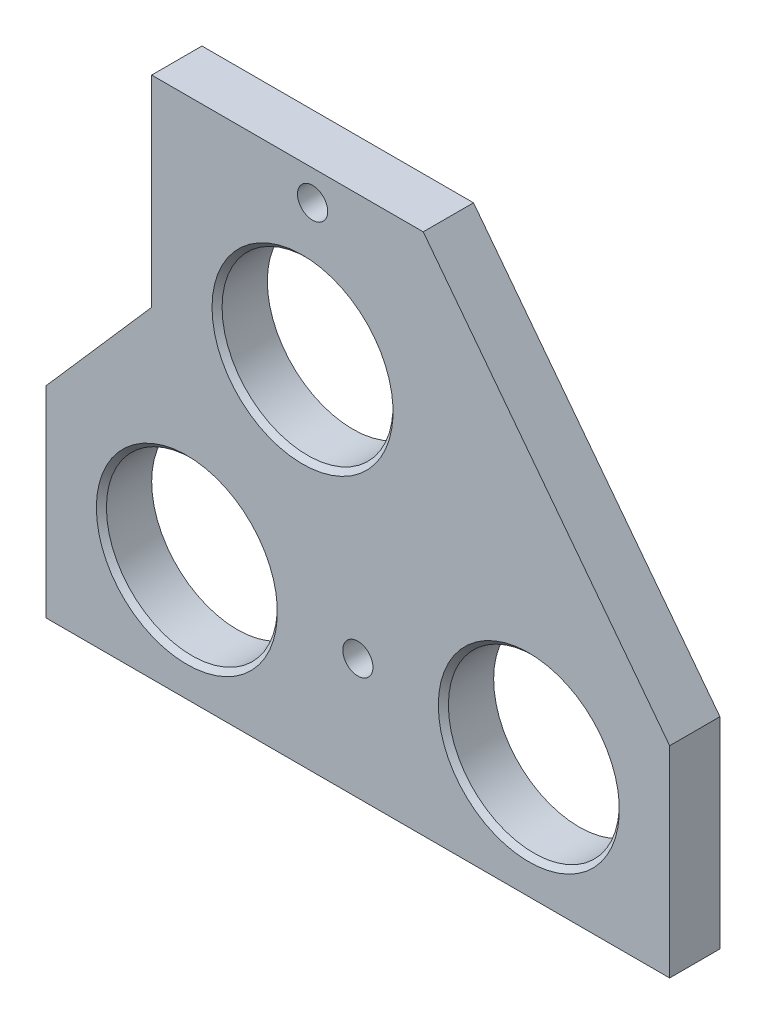
ISO-10303-21;
HEADER;
FILE_DESCRIPTION(('STEP AP214'),'2;1');
FILE_NAME('part.step','',(''),(''),'','','');
FILE_SCHEMA(('AUTOMOTIVE_DESIGN { 1 0 10303 214 1 1 1 1 }'));
ENDSEC;
DATA;
#1=APPLICATION_CONTEXT('core data for automotive mechanical design processes');
#2=APPLICATION_PROTOCOL_DEFINITION('international standard','automotive_design',2000,#1);
#3=PRODUCT_CONTEXT('',#1,'mechanical');
#4=PRODUCT('Part','Part','',(#3));
#5=PRODUCT_RELATED_PRODUCT_CATEGORY('part','',(#4));
#6=PRODUCT_DEFINITION_FORMATION('','',#4);
#7=PRODUCT_DEFINITION_CONTEXT('part definition',#1,'design');
#8=PRODUCT_DEFINITION('design','',#6,#7);
#9=PRODUCT_DEFINITION_SHAPE('','',#8);
#10=(LENGTH_UNIT() NAMED_UNIT(*) SI_UNIT(.MILLI.,.METRE.));
#11=(NAMED_UNIT(*) PLANE_ANGLE_UNIT() SI_UNIT($,.RADIAN.));
#12=(NAMED_UNIT(*) SI_UNIT($,.STERADIAN.) SOLID_ANGLE_UNIT());
#13=UNCERTAINTY_MEASURE_WITH_UNIT(LENGTH_MEASURE(1.E-05),#10,'distance_accuracy_value','');
#14=(GEOMETRIC_REPRESENTATION_CONTEXT(3) GLOBAL_UNCERTAINTY_ASSIGNED_CONTEXT((#13)) GLOBAL_UNIT_ASSIGNED_CONTEXT((#10,
#11,#12)) REPRESENTATION_CONTEXT('',''));
#15=CARTESIAN_POINT('',(0.,0.,0.));
#16=DIRECTION('',(0.,0.,1.));
#17=DIRECTION('',(1.,0.,0.));
#18=AXIS2_PLACEMENT_3D('',#15,#16,#17);
#19=CARTESIAN_POINT('',(0.,0.,5.));
#20=DIRECTION('',(0.,0.,-1.));
#21=DIRECTION('',(-1.,0.,0.));
#22=AXIS2_PLACEMENT_3D('',#19,#20,#21);
#23=PLANE('',#22);
#24=CARTESIAN_POINT('',(34.,0.,5.));
#25=DIRECTION('',(0.,0.,-1.));
#26=DIRECTION('',(-1.,0.,0.));
#27=AXIS2_PLACEMENT_3D('',#24,#25,#26);
#28=CIRCLE('',#27,8.99999999999999);
#29=CARTESIAN_POINT('',(25.,0.,5.));
#30=VERTEX_POINT('',#29);
#31=EDGE_CURVE('E190',#30,#30,#28,.T.);
#32=ORIENTED_EDGE('',*,*,#31,.T.);
#33=EDGE_LOOP('',(#32));
#34=FACE_BOUND('',#33,.T.);
#35=CARTESIAN_POINT('',(11.5,23.,5.));
#36=DIRECTION('',(0.,0.,-1.));
#37=DIRECTION('',(-1.,0.,0.));
#38=AXIS2_PLACEMENT_3D('',#35,#36,#37);
#39=CIRCLE('',#38,9.00000000000002);
#40=CARTESIAN_POINT('',(2.49999999999997,23.,5.));
#41=VERTEX_POINT('',#40);
#42=EDGE_CURVE('E186',#41,#41,#39,.T.);
#43=ORIENTED_EDGE('',*,*,#42,.T.);
#44=EDGE_LOOP('',(#43));
#45=FACE_BOUND('',#44,.T.);
#46=CARTESIAN_POINT('',(0.,0.,5.));
#47=DIRECTION('',(0.,0.,-1.));
#48=DIRECTION('',(-1.,0.,0.));
#49=AXIS2_PLACEMENT_3D('',#46,#47,#48);
#50=CIRCLE('',#49,9.00000000000002);
#51=CARTESIAN_POINT('',(-9.00000000000002,0.,5.));
#52=VERTEX_POINT('',#51);
#53=EDGE_CURVE('E182',#52,#52,#50,.T.);
#54=ORIENTED_EDGE('',*,*,#53,.T.);
#55=EDGE_LOOP('',(#54));
#56=FACE_BOUND('',#55,.T.);
#57=DIRECTION('',(1.,0.,0.));
#58=VECTOR('',#57,1.);
#59=CARTESIAN_POINT('',(48.,-12.,5.));
#60=LINE('',#59,#58);
#61=CARTESIAN_POINT('',(-14.,-12.,5.));
#62=VERTEX_POINT('',#61);
#63=CARTESIAN_POINT('',(48.,-12.,5.));
#64=VERTEX_POINT('',#63);
#65=EDGE_CURVE('E160',#62,#64,#60,.T.);
#66=ORIENTED_EDGE('',*,*,#65,.T.);
#67=DIRECTION('',(0.,1.,0.));
#68=VECTOR('',#67,1.);
#69=CARTESIAN_POINT('',(48.,8.00000000000001,5.));
#70=LINE('',#69,#68);
#71=CARTESIAN_POINT('',(48.,8.00000000000001,5.));
#72=VERTEX_POINT('',#71);
#73=EDGE_CURVE('E101',#64,#72,#70,.T.);
#74=ORIENTED_EDGE('',*,*,#73,.T.);
#75=DIRECTION('',(-0.607910502716913,0.794005554569029,0.));
#76=VECTOR('',#75,1.);
#77=CARTESIAN_POINT('',(23.5,40.,5.));
#78=LINE('',#77,#76);
#79=CARTESIAN_POINT('',(23.5,40.,5.));
#80=VERTEX_POINT('',#79);
#81=EDGE_CURVE('E268',#72,#80,#78,.T.);
#82=ORIENTED_EDGE('',*,*,#81,.T.);
#83=DIRECTION('',(-1.,0.,0.));
#84=VECTOR('',#83,1.);
#85=CARTESIAN_POINT('',(-3.5,40.,5.));
#86=LINE('',#85,#84);
#87=CARTESIAN_POINT('',(-3.5,40.,5.));
#88=VERTEX_POINT('',#87);
#89=EDGE_CURVE('E117',#80,#88,#86,.T.);
#90=ORIENTED_EDGE('',*,*,#89,.T.);
#91=DIRECTION('',(0.,-1.,0.));
#92=VECTOR('',#91,1.);
#93=CARTESIAN_POINT('',(-3.5,40.,5.));
#94=LINE('',#93,#92);
#95=CARTESIAN_POINT('',(-3.5,20.,5.));
#96=VERTEX_POINT('',#95);
#97=EDGE_CURVE('E111',#88,#96,#94,.T.);
#98=ORIENTED_EDGE('',*,*,#97,.T.);
#99=DIRECTION('',(-0.658504607868518,-0.752576694706878,0.));
#100=VECTOR('',#99,1.);
#101=CARTESIAN_POINT('',(-14.,8.,5.));
#102=LINE('',#101,#100);
#103=CARTESIAN_POINT('',(-14.,8.,5.));
#104=VERTEX_POINT('',#103);
#105=EDGE_CURVE('E115',#96,#104,#102,.T.);
#106=ORIENTED_EDGE('',*,*,#105,.T.);
#107=DIRECTION('',(0.,-1.,0.));
#108=VECTOR('',#107,1.);
#109=CARTESIAN_POINT('',(-14.,-12.,5.));
#110=LINE('',#109,#108);
#111=EDGE_CURVE('E60',#104,#62,#110,.T.);
#112=ORIENTED_EDGE('',*,*,#111,.T.);
#113=EDGE_LOOP('',(#66,#74,#82,#90,#98,#106,#112));
#114=FACE_BOUND('',#113,.T.);
#115=CARTESIAN_POINT('',(12.5,37.,5.));
#116=DIRECTION('',(0.,0.,1.));
#117=DIRECTION('',(1.,0.,0.));
#118=AXIS2_PLACEMENT_3D('',#115,#116,#117);
#119=CIRCLE('',#118,1.5);
#120=CARTESIAN_POINT('',(14.,37.,5.));
#121=VERTEX_POINT('',#120);
#122=EDGE_CURVE('E289',#121,#121,#119,.T.);
#123=ORIENTED_EDGE('',*,*,#122,.F.);
#124=EDGE_LOOP('',(#123));
#125=FACE_BOUND('',#124,.T.);
#126=CARTESIAN_POINT('',(17.,0.,5.));
#127=DIRECTION('',(0.,0.,1.));
#128=DIRECTION('',(1.,0.,0.));
#129=AXIS2_PLACEMENT_3D('',#126,#127,#128);
#130=CIRCLE('',#129,1.5);
#131=CARTESIAN_POINT('',(18.5,0.,5.));
#132=VERTEX_POINT('',#131);
#133=EDGE_CURVE('E294',#132,#132,#130,.T.);
#134=ORIENTED_EDGE('',*,*,#133,.F.);
#135=EDGE_LOOP('',(#134));
#136=FACE_BOUND('',#135,.T.);
#137=ADVANCED_FACE('F41',(#34,#45,#56,#114,#125,#136),#23,.F.);
#138=CARTESIAN_POINT('',(0.,0.,0.));
#139=DIRECTION('',(0.,0.,-1.));
#140=DIRECTION('',(-1.,0.,0.));
#141=AXIS2_PLACEMENT_3D('',#138,#139,#140);
#142=PLANE('',#141);
#143=CARTESIAN_POINT('',(12.5,37.,0.));
#144=DIRECTION('',(0.,0.,1.));
#145=DIRECTION('',(1.,0.,0.));
#146=AXIS2_PLACEMENT_3D('',#143,#144,#145);
#147=CIRCLE('',#146,1.5);
#148=CARTESIAN_POINT('',(14.,37.,0.));
#149=VERTEX_POINT('',#148);
#150=EDGE_CURVE('E290',#149,#149,#147,.T.);
#151=ORIENTED_EDGE('',*,*,#150,.T.);
#152=EDGE_LOOP('',(#151));
#153=FACE_BOUND('',#152,.T.);
#154=CARTESIAN_POINT('',(34.,0.,0.));
#155=DIRECTION('',(0.,0.,1.));
#156=DIRECTION('',(1.,0.,0.));
#157=AXIS2_PLACEMENT_3D('',#154,#155,#156);
#158=CIRCLE('',#157,8.5);
#159=CARTESIAN_POINT('',(42.5,0.,0.));
#160=VERTEX_POINT('',#159);
#161=EDGE_CURVE('E281',#160,#160,#158,.T.);
#162=ORIENTED_EDGE('',*,*,#161,.T.);
#163=EDGE_LOOP('',(#162));
#164=FACE_BOUND('',#163,.T.);
#165=DIRECTION('',(1.,0.,0.));
#166=VECTOR('',#165,1.);
#167=CARTESIAN_POINT('',(48.,-12.,0.));
#168=LINE('',#167,#166);
#169=CARTESIAN_POINT('',(-14.,-12.,0.));
#170=VERTEX_POINT('',#169);
#171=CARTESIAN_POINT('',(48.,-12.,0.));
#172=VERTEX_POINT('',#171);
#173=EDGE_CURVE('E140',#170,#172,#168,.T.);
#174=ORIENTED_EDGE('',*,*,#173,.F.);
#175=DIRECTION('',(0.,-1.,0.));
#176=VECTOR('',#175,1.);
#177=CARTESIAN_POINT('',(-14.,-12.,0.));
#178=LINE('',#177,#176);
#179=CARTESIAN_POINT('',(-14.,8.,0.));
#180=VERTEX_POINT('',#179);
#181=EDGE_CURVE('E92',#180,#170,#178,.T.);
#182=ORIENTED_EDGE('',*,*,#181,.F.);
#183=DIRECTION('',(-0.658504607868518,-0.752576694706878,0.));
#184=VECTOR('',#183,1.);
#185=CARTESIAN_POINT('',(-14.,8.,0.));
#186=LINE('',#185,#184);
#187=CARTESIAN_POINT('',(-3.5,20.,0.));
#188=VERTEX_POINT('',#187);
#189=EDGE_CURVE('E86',#188,#180,#186,.T.);
#190=ORIENTED_EDGE('',*,*,#189,.F.);
#191=DIRECTION('',(0.,-1.,0.));
#192=VECTOR('',#191,1.);
#193=CARTESIAN_POINT('',(-3.5,40.,0.));
#194=LINE('',#193,#192);
#195=CARTESIAN_POINT('',(-3.5,40.,0.));
#196=VERTEX_POINT('',#195);
#197=EDGE_CURVE('E126',#196,#188,#194,.T.);
#198=ORIENTED_EDGE('',*,*,#197,.F.);
#199=DIRECTION('',(-1.,0.,0.));
#200=VECTOR('',#199,1.);
#201=CARTESIAN_POINT('',(-3.5,40.,0.));
#202=LINE('',#201,#200);
#203=CARTESIAN_POINT('',(23.5,40.,0.));
#204=VERTEX_POINT('',#203);
#205=EDGE_CURVE('E151',#204,#196,#202,.T.);
#206=ORIENTED_EDGE('',*,*,#205,.F.);
#207=DIRECTION('',(-0.607910502716913,0.794005554569029,0.));
#208=VECTOR('',#207,1.);
#209=CARTESIAN_POINT('',(23.5,40.,0.));
#210=LINE('',#209,#208);
#211=CARTESIAN_POINT('',(48.,8.00000000000001,0.));
#212=VERTEX_POINT('',#211);
#213=EDGE_CURVE('E148',#212,#204,#210,.T.);
#214=ORIENTED_EDGE('',*,*,#213,.F.);
#215=DIRECTION('',(0.,1.,0.));
#216=VECTOR('',#215,1.);
#217=CARTESIAN_POINT('',(48.,8.00000000000001,0.));
#218=LINE('',#217,#216);
#219=EDGE_CURVE('E144',#172,#212,#218,.T.);
#220=ORIENTED_EDGE('',*,*,#219,.F.);
#221=EDGE_LOOP('',(#174,#182,#190,#198,#206,#214,#220));
#222=FACE_BOUND('',#221,.T.);
#223=CARTESIAN_POINT('',(0.,0.,0.));
#224=DIRECTION('',(0.,0.,1.));
#225=DIRECTION('',(1.,0.,0.));
#226=AXIS2_PLACEMENT_3D('',#223,#224,#225);
#227=CIRCLE('',#226,8.5);
#228=CARTESIAN_POINT('',(8.5,0.,0.));
#229=VERTEX_POINT('',#228);
#230=EDGE_CURVE('E145',#229,#229,#227,.T.);
#231=ORIENTED_EDGE('',*,*,#230,.T.);
#232=EDGE_LOOP('',(#231));
#233=FACE_BOUND('',#232,.T.);
#234=CARTESIAN_POINT('',(11.5,23.,0.));
#235=DIRECTION('',(0.,0.,1.));
#236=DIRECTION('',(1.,0.,0.));
#237=AXIS2_PLACEMENT_3D('',#234,#235,#236);
#238=CIRCLE('',#237,8.5);
#239=CARTESIAN_POINT('',(20.,23.,0.));
#240=VERTEX_POINT('',#239);
#241=EDGE_CURVE('E285',#240,#240,#238,.T.);
#242=ORIENTED_EDGE('',*,*,#241,.T.);
#243=EDGE_LOOP('',(#242));
#244=FACE_BOUND('',#243,.T.);
#245=CARTESIAN_POINT('',(17.,0.,0.));
#246=DIRECTION('',(0.,0.,1.));
#247=DIRECTION('',(1.,0.,0.));
#248=AXIS2_PLACEMENT_3D('',#245,#246,#247);
#249=CIRCLE('',#248,1.5);
#250=CARTESIAN_POINT('',(18.5,0.,0.));
#251=VERTEX_POINT('',#250);
#252=EDGE_CURVE('E298',#251,#251,#249,.T.);
#253=ORIENTED_EDGE('',*,*,#252,.T.);
#254=EDGE_LOOP('',(#253));
#255=FACE_BOUND('',#254,.T.);
#256=ADVANCED_FACE('F216',(#153,#164,#222,#233,#244,#255),#142,.T.);
#257=CARTESIAN_POINT('',(48.,-12.,5.));
#258=DIRECTION('',(0.,1.,0.));
#259=DIRECTION('',(-1.,0.,0.));
#260=AXIS2_PLACEMENT_3D('',#257,#258,#259);
#261=PLANE('',#260);
#262=ORIENTED_EDGE('',*,*,#173,.T.);
#263=DIRECTION('',(0.,0.,-1.));
#264=VECTOR('',#263,1.);
#265=CARTESIAN_POINT('',(48.,-12.,5.));
#266=LINE('',#265,#264);
#267=EDGE_CURVE('E175',#64,#172,#266,.T.);
#268=ORIENTED_EDGE('',*,*,#267,.F.);
#269=ORIENTED_EDGE('',*,*,#65,.F.);
#270=DIRECTION('',(0.,0.,-1.));
#271=VECTOR('',#270,1.);
#272=CARTESIAN_POINT('',(-14.,-12.,5.));
#273=LINE('',#272,#271);
#274=EDGE_CURVE('E136',#62,#170,#273,.T.);
#275=ORIENTED_EDGE('',*,*,#274,.T.);
#276=EDGE_LOOP('',(#262,#268,#269,#275));
#277=FACE_BOUND('',#276,.T.);
#278=ADVANCED_FACE('F222',(#277),#261,.F.);
#279=CARTESIAN_POINT('',(48.,8.00000000000001,5.));
#280=DIRECTION('',(-1.,0.,0.));
#281=DIRECTION('',(0.,0.,1.));
#282=AXIS2_PLACEMENT_3D('',#279,#280,#281);
#283=PLANE('',#282);
#284=ORIENTED_EDGE('',*,*,#219,.T.);
#285=DIRECTION('',(0.,0.,-1.));
#286=VECTOR('',#285,1.);
#287=CARTESIAN_POINT('',(48.,8.00000000000001,5.));
#288=LINE('',#287,#286);
#289=EDGE_CURVE('E171',#72,#212,#288,.T.);
#290=ORIENTED_EDGE('',*,*,#289,.F.);
#291=ORIENTED_EDGE('',*,*,#73,.F.);
#292=ORIENTED_EDGE('',*,*,#267,.T.);
#293=EDGE_LOOP('',(#284,#290,#291,#292));
#294=FACE_BOUND('',#293,.T.);
#295=ADVANCED_FACE('F244',(#294),#283,.F.);
#296=CARTESIAN_POINT('',(23.5,40.,5.));
#297=DIRECTION('',(-0.794005554569029,-0.607910502716913,0.));
#298=DIRECTION('',(0.607910502716913,-0.794005554569029,0.));
#299=AXIS2_PLACEMENT_3D('',#296,#297,#298);
#300=PLANE('',#299);
#301=ORIENTED_EDGE('',*,*,#213,.T.);
#302=DIRECTION('',(0.,0.,-1.));
#303=VECTOR('',#302,1.);
#304=CARTESIAN_POINT('',(23.5,40.,5.));
#305=LINE('',#304,#303);
#306=EDGE_CURVE('E167',#80,#204,#305,.T.);
#307=ORIENTED_EDGE('',*,*,#306,.F.);
#308=ORIENTED_EDGE('',*,*,#81,.F.);
#309=ORIENTED_EDGE('',*,*,#289,.T.);
#310=EDGE_LOOP('',(#301,#307,#308,#309));
#311=FACE_BOUND('',#310,.T.);
#312=ADVANCED_FACE('F240',(#311),#300,.F.);
#313=CARTESIAN_POINT('',(-3.5,40.,5.));
#314=DIRECTION('',(0.,-1.,0.));
#315=DIRECTION('',(0.,0.,-1.));
#316=AXIS2_PLACEMENT_3D('',#313,#314,#315);
#317=PLANE('',#316);
#318=ORIENTED_EDGE('',*,*,#205,.T.);
#319=DIRECTION('',(0.,0.,-1.));
#320=VECTOR('',#319,1.);
#321=CARTESIAN_POINT('',(-3.5,40.,5.));
#322=LINE('',#321,#320);
#323=EDGE_CURVE('E128',#88,#196,#322,.T.);
#324=ORIENTED_EDGE('',*,*,#323,.F.);
#325=ORIENTED_EDGE('',*,*,#89,.F.);
#326=ORIENTED_EDGE('',*,*,#306,.T.);
#327=EDGE_LOOP('',(#318,#324,#325,#326));
#328=FACE_BOUND('',#327,.T.);
#329=ADVANCED_FACE('F237',(#328),#317,.F.);
#330=CARTESIAN_POINT('',(-3.5,40.,5.));
#331=DIRECTION('',(1.,0.,0.));
#332=DIRECTION('',(0.,1.,0.));
#333=AXIS2_PLACEMENT_3D('',#330,#331,#332);
#334=PLANE('',#333);
#335=ORIENTED_EDGE('',*,*,#197,.T.);
#336=DIRECTION('',(0.,0.,-1.));
#337=VECTOR('',#336,1.);
#338=CARTESIAN_POINT('',(-3.5,20.,5.));
#339=LINE('',#338,#337);
#340=EDGE_CURVE('E123',#96,#188,#339,.T.);
#341=ORIENTED_EDGE('',*,*,#340,.F.);
#342=ORIENTED_EDGE('',*,*,#97,.F.);
#343=ORIENTED_EDGE('',*,*,#323,.T.);
#344=EDGE_LOOP('',(#335,#341,#342,#343));
#345=FACE_BOUND('',#344,.T.);
#346=ADVANCED_FACE('F124',(#345),#334,.F.);
#347=CARTESIAN_POINT('',(-14.,8.,5.));
#348=DIRECTION('',(0.752576694706878,-0.658504607868518,0.));
#349=DIRECTION('',(0.658504607868518,0.752576694706878,0.));
#350=AXIS2_PLACEMENT_3D('',#347,#348,#349);
#351=PLANE('',#350);
#352=ORIENTED_EDGE('',*,*,#189,.T.);
#353=DIRECTION('',(0.,0.,-1.));
#354=VECTOR('',#353,1.);
#355=CARTESIAN_POINT('',(-14.,8.,5.));
#356=LINE('',#355,#354);
#357=EDGE_CURVE('E129',#104,#180,#356,.T.);
#358=ORIENTED_EDGE('',*,*,#357,.F.);
#359=ORIENTED_EDGE('',*,*,#105,.F.);
#360=ORIENTED_EDGE('',*,*,#340,.T.);
#361=EDGE_LOOP('',(#352,#358,#359,#360));
#362=FACE_BOUND('',#361,.T.);
#363=ADVANCED_FACE('F131',(#362),#351,.F.);
#364=CARTESIAN_POINT('',(-14.,-12.,5.));
#365=DIRECTION('',(1.,0.,0.));
#366=DIRECTION('',(0.,0.,-1.));
#367=AXIS2_PLACEMENT_3D('',#364,#365,#366);
#368=PLANE('',#367);
#369=ORIENTED_EDGE('',*,*,#181,.T.);
#370=ORIENTED_EDGE('',*,*,#274,.F.);
#371=ORIENTED_EDGE('',*,*,#111,.F.);
#372=ORIENTED_EDGE('',*,*,#357,.T.);
#373=EDGE_LOOP('',(#369,#370,#371,#372));
#374=FACE_BOUND('',#373,.T.);
#375=ADVANCED_FACE('F230',(#374),#368,.F.);
#376=CARTESIAN_POINT('',(0.,0.,5.));
#377=DIRECTION('',(0.,0.,-1.));
#378=DIRECTION('',(-1.,0.,0.));
#379=AXIS2_PLACEMENT_3D('',#376,#377,#378);
#380=CYLINDRICAL_SURFACE('',#379,8.5);
#381=CARTESIAN_POINT('',(0.,0.,4.49999999999999));
#382=DIRECTION('',(0.,0.,-1.));
#383=DIRECTION('',(-1.,0.,0.));
#384=AXIS2_PLACEMENT_3D('',#381,#382,#383);
#385=CIRCLE('',#384,8.5);
#386=CARTESIAN_POINT('',(-8.5,0.,4.49999999999999));
#387=VERTEX_POINT('',#386);
#388=EDGE_CURVE('E11',#387,#387,#385,.F.);
#389=ORIENTED_EDGE('',*,*,#388,.T.);
#390=EDGE_LOOP('',(#389));
#391=FACE_BOUND('',#390,.T.);
#392=ORIENTED_EDGE('',*,*,#230,.F.);
#393=EDGE_LOOP('',(#392));
#394=FACE_BOUND('',#393,.T.);
#395=ADVANCED_FACE('F227',(#391,#394),#380,.F.);
#396=CARTESIAN_POINT('',(34.,0.,5.));
#397=DIRECTION('',(0.,0.,-1.));
#398=DIRECTION('',(-1.,0.,0.));
#399=AXIS2_PLACEMENT_3D('',#396,#397,#398);
#400=CYLINDRICAL_SURFACE('',#399,8.5);
#401=CARTESIAN_POINT('',(34.,0.,4.5));
#402=DIRECTION('',(0.,0.,-1.));
#403=DIRECTION('',(-1.,0.,0.));
#404=AXIS2_PLACEMENT_3D('',#401,#402,#403);
#405=CIRCLE('',#404,8.5);
#406=CARTESIAN_POINT('',(25.5,0.,4.5));
#407=VERTEX_POINT('',#406);
#408=EDGE_CURVE('E178',#407,#407,#405,.F.);
#409=ORIENTED_EDGE('',*,*,#408,.T.);
#410=EDGE_LOOP('',(#409));
#411=FACE_BOUND('',#410,.T.);
#412=ORIENTED_EDGE('',*,*,#161,.F.);
#413=EDGE_LOOP('',(#412));
#414=FACE_BOUND('',#413,.T.);
#415=ADVANCED_FACE('F321',(#411,#414),#400,.F.);
#416=CARTESIAN_POINT('',(11.5,23.,5.));
#417=DIRECTION('',(0.,0.,-1.));
#418=DIRECTION('',(-1.,0.,0.));
#419=AXIS2_PLACEMENT_3D('',#416,#417,#418);
#420=CYLINDRICAL_SURFACE('',#419,8.5);
#421=CARTESIAN_POINT('',(11.5,23.,4.49999999999999));
#422=DIRECTION('',(0.,0.,-1.));
#423=DIRECTION('',(-1.,0.,0.));
#424=AXIS2_PLACEMENT_3D('',#421,#422,#423);
#425=CIRCLE('',#424,8.5);
#426=CARTESIAN_POINT('',(3.,23.,4.49999999999999));
#427=VERTEX_POINT('',#426);
#428=EDGE_CURVE('E52',#427,#427,#425,.F.);
#429=ORIENTED_EDGE('',*,*,#428,.T.);
#430=EDGE_LOOP('',(#429));
#431=FACE_BOUND('',#430,.T.);
#432=ORIENTED_EDGE('',*,*,#241,.F.);
#433=EDGE_LOOP('',(#432));
#434=FACE_BOUND('',#433,.T.);
#435=ADVANCED_FACE('F198',(#431,#434),#420,.F.);
#436=CARTESIAN_POINT('',(12.5,37.,5.));
#437=DIRECTION('',(0.,0.,-1.));
#438=DIRECTION('',(-1.,0.,0.));
#439=AXIS2_PLACEMENT_3D('',#436,#437,#438);
#440=CYLINDRICAL_SURFACE('',#439,1.5);
#441=ORIENTED_EDGE('',*,*,#122,.T.);
#442=EDGE_LOOP('',(#441));
#443=FACE_BOUND('',#442,.T.);
#444=ORIENTED_EDGE('',*,*,#150,.F.);
#445=EDGE_LOOP('',(#444));
#446=FACE_BOUND('',#445,.T.);
#447=ADVANCED_FACE('F310',(#443,#446),#440,.F.);
#448=CARTESIAN_POINT('',(17.,0.,5.));
#449=DIRECTION('',(0.,0.,-1.));
#450=DIRECTION('',(-1.,0.,0.));
#451=AXIS2_PLACEMENT_3D('',#448,#449,#450);
#452=CYLINDRICAL_SURFACE('',#451,1.5);
#453=ORIENTED_EDGE('',*,*,#133,.T.);
#454=EDGE_LOOP('',(#453));
#455=FACE_BOUND('',#454,.T.);
#456=ORIENTED_EDGE('',*,*,#252,.F.);
#457=EDGE_LOOP('',(#456));
#458=FACE_BOUND('',#457,.T.);
#459=ADVANCED_FACE('F210',(#455,#458),#452,.F.);
#460=CARTESIAN_POINT('',(34.,0.,4.5));
#461=DIRECTION('',(0.,0.,1.));
#462=DIRECTION('',(1.,0.,0.));
#463=AXIS2_PLACEMENT_3D('',#460,#461,#462);
#464=CONICAL_SURFACE('',#463,8.5,0.785398163397447);
#465=ORIENTED_EDGE('',*,*,#31,.F.);
#466=EDGE_LOOP('',(#465));
#467=FACE_BOUND('',#466,.T.);
#468=ORIENTED_EDGE('',*,*,#408,.F.);
#469=EDGE_LOOP('',(#468));
#470=FACE_BOUND('',#469,.T.);
#471=ADVANCED_FACE('F203',(#467,#470),#464,.F.);
#472=CARTESIAN_POINT('',(11.5,23.,4.49999999999999));
#473=DIRECTION('',(0.,0.,1.));
#474=DIRECTION('',(1.,0.,0.));
#475=AXIS2_PLACEMENT_3D('',#472,#473,#474);
#476=CONICAL_SURFACE('',#475,8.5,0.78539816339746);
#477=ORIENTED_EDGE('',*,*,#42,.F.);
#478=EDGE_LOOP('',(#477));
#479=FACE_BOUND('',#478,.T.);
#480=ORIENTED_EDGE('',*,*,#428,.F.);
#481=EDGE_LOOP('',(#480));
#482=FACE_BOUND('',#481,.T.);
#483=ADVANCED_FACE('F201',(#479,#482),#476,.F.);
#484=CARTESIAN_POINT('',(0.,0.,4.49999999999999));
#485=DIRECTION('',(0.,0.,1.));
#486=DIRECTION('',(1.,0.,0.));
#487=AXIS2_PLACEMENT_3D('',#484,#485,#486);
#488=CONICAL_SURFACE('',#487,8.5,0.78539816339746);
#489=ORIENTED_EDGE('',*,*,#53,.F.);
#490=EDGE_LOOP('',(#489));
#491=FACE_BOUND('',#490,.T.);
#492=ORIENTED_EDGE('',*,*,#388,.F.);
#493=EDGE_LOOP('',(#492));
#494=FACE_BOUND('',#493,.T.);
#495=ADVANCED_FACE('F44',(#491,#494),#488,.F.);
#496=CLOSED_SHELL('',(#137,#256,#278,#295,#312,#329,#346,#363,#375,#395,#415,#435,#447,#459,
#471,#483,#495));
#497=MANIFOLD_SOLID_BREP('B2',#496);
#498=ADVANCED_BREP_SHAPE_REPRESENTATION('',(#18,#497),#14);
#499=SHAPE_DEFINITION_REPRESENTATION(#9,#498);
ENDSEC;
END-ISO-10303-21;
